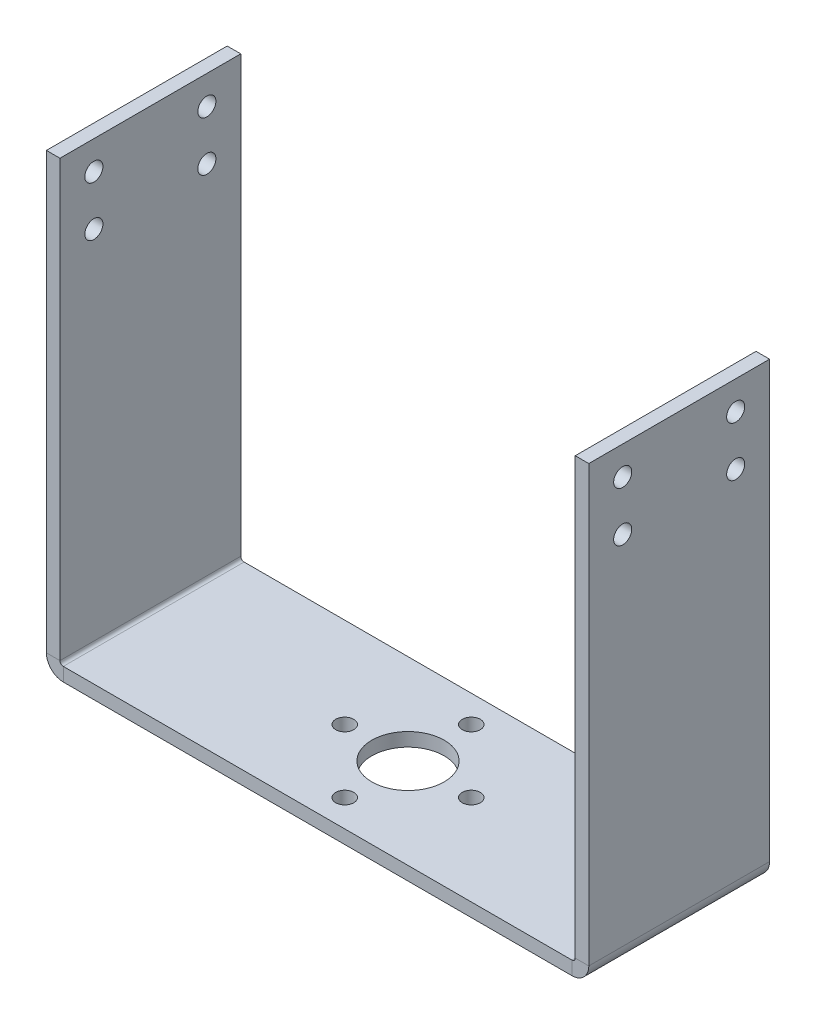
ISO-10303-21;
HEADER;
FILE_DESCRIPTION(('STEP AP214'),'2;1');
FILE_NAME('part.step','',(''),(''),'','','');
FILE_SCHEMA(('AUTOMOTIVE_DESIGN { 1 0 10303 214 1 1 1 1 }'));
ENDSEC;
DATA;
#1=APPLICATION_CONTEXT('core data for automotive mechanical design processes');
#2=APPLICATION_PROTOCOL_DEFINITION('international standard','automotive_design',2000,#1);
#3=PRODUCT_CONTEXT('',#1,'mechanical');
#4=PRODUCT('Part','Part','',(#3));
#5=PRODUCT_RELATED_PRODUCT_CATEGORY('part','',(#4));
#6=PRODUCT_DEFINITION_FORMATION('','',#4);
#7=PRODUCT_DEFINITION_CONTEXT('part definition',#1,'design');
#8=PRODUCT_DEFINITION('design','',#6,#7);
#9=PRODUCT_DEFINITION_SHAPE('','',#8);
#10=(LENGTH_UNIT() NAMED_UNIT(*) SI_UNIT(.MILLI.,.METRE.));
#11=(NAMED_UNIT(*) PLANE_ANGLE_UNIT() SI_UNIT($,.RADIAN.));
#12=(NAMED_UNIT(*) SI_UNIT($,.STERADIAN.) SOLID_ANGLE_UNIT());
#13=UNCERTAINTY_MEASURE_WITH_UNIT(LENGTH_MEASURE(1.E-05),#10,'distance_accuracy_value','');
#14=(GEOMETRIC_REPRESENTATION_CONTEXT(3) GLOBAL_UNCERTAINTY_ASSIGNED_CONTEXT((#13)) GLOBAL_UNIT_ASSIGNED_CONTEXT((#10,
#11,#12)) REPRESENTATION_CONTEXT('',''));
#15=CARTESIAN_POINT('',(0.,0.,0.));
#16=DIRECTION('',(0.,0.,1.));
#17=DIRECTION('',(1.,0.,0.));
#18=AXIS2_PLACEMENT_3D('',#15,#16,#17);
#19=CARTESIAN_POINT('',(0.,-3.,0.));
#20=DIRECTION('',(0.,1.,0.));
#21=DIRECTION('',(0.,0.,1.));
#22=AXIS2_PLACEMENT_3D('',#19,#20,#21);
#23=PLANE('',#22);
#24=CARTESIAN_POINT('',(0.,-3.,-14.));
#25=DIRECTION('',(0.,-1.,0.));
#26=DIRECTION('',(0.,0.,-1.));
#27=AXIS2_PLACEMENT_3D('',#24,#25,#26);
#28=CIRCLE('',#27,2.);
#29=CARTESIAN_POINT('',(0.,-3.,-16.));
#30=VERTEX_POINT('',#29);
#31=EDGE_CURVE('E300',#30,#30,#28,.T.);
#32=ORIENTED_EDGE('',*,*,#31,.F.);
#33=EDGE_LOOP('',(#32));
#34=FACE_BOUND('',#33,.T.);
#35=CARTESIAN_POINT('',(-14.,-3.,0.));
#36=DIRECTION('',(0.,-1.,0.));
#37=DIRECTION('',(0.,0.,-1.));
#38=AXIS2_PLACEMENT_3D('',#35,#36,#37);
#39=CIRCLE('',#38,2.);
#40=CARTESIAN_POINT('',(-14.,-3.,-2.));
#41=VERTEX_POINT('',#40);
#42=EDGE_CURVE('E297',#41,#41,#39,.T.);
#43=ORIENTED_EDGE('',*,*,#42,.F.);
#44=EDGE_LOOP('',(#43));
#45=FACE_BOUND('',#44,.T.);
#46=CARTESIAN_POINT('',(0.,-3.,14.));
#47=DIRECTION('',(0.,-1.,0.));
#48=DIRECTION('',(0.,0.,-1.));
#49=AXIS2_PLACEMENT_3D('',#46,#47,#48);
#50=CIRCLE('',#49,2.);
#51=CARTESIAN_POINT('',(0.,-3.,12.));
#52=VERTEX_POINT('',#51);
#53=EDGE_CURVE('E294',#52,#52,#50,.T.);
#54=ORIENTED_EDGE('',*,*,#53,.F.);
#55=EDGE_LOOP('',(#54));
#56=FACE_BOUND('',#55,.T.);
#57=CARTESIAN_POINT('',(14.,-3.,0.));
#58=DIRECTION('',(0.,-1.,0.));
#59=DIRECTION('',(0.,0.,-1.));
#60=AXIS2_PLACEMENT_3D('',#57,#58,#59);
#61=CIRCLE('',#60,2.);
#62=CARTESIAN_POINT('',(14.,-3.,-2.));
#63=VERTEX_POINT('',#62);
#64=EDGE_CURVE('E293',#63,#63,#61,.T.);
#65=ORIENTED_EDGE('',*,*,#64,.F.);
#66=EDGE_LOOP('',(#65));
#67=FACE_BOUND('',#66,.T.);
#68=CARTESIAN_POINT('',(0.,-3.,0.));
#69=DIRECTION('',(0.,-1.,0.));
#70=DIRECTION('',(0.,0.,-1.));
#71=AXIS2_PLACEMENT_3D('',#68,#69,#70);
#72=CIRCLE('',#71,8.);
#73=CARTESIAN_POINT('',(0.,-3.,-8.));
#74=VERTEX_POINT('',#73);
#75=EDGE_CURVE('E255',#74,#74,#72,.T.);
#76=ORIENTED_EDGE('',*,*,#75,.F.);
#77=EDGE_LOOP('',(#76));
#78=FACE_BOUND('',#77,.T.);
#79=DIRECTION('',(0.,0.,-1.));
#80=VECTOR('',#79,1.);
#81=CARTESIAN_POINT('',(56.2634000000001,-2.99999999999998,-20.));
#82=LINE('',#81,#80);
#83=CARTESIAN_POINT('',(56.2634000000001,-2.99999999999998,-20.));
#84=VERTEX_POINT('',#83);
#85=CARTESIAN_POINT('',(56.2634,-3.,20.));
#86=VERTEX_POINT('',#85);
#87=EDGE_CURVE('E137',#84,#86,#82,.F.);
#88=ORIENTED_EDGE('',*,*,#87,.T.);
#89=DIRECTION('',(1.,0.,0.));
#90=VECTOR('',#89,1.);
#91=CARTESIAN_POINT('',(-57.,-3.,20.));
#92=LINE('',#91,#90);
#93=CARTESIAN_POINT('',(-56.2634,-3.,20.));
#94=VERTEX_POINT('',#93);
#95=EDGE_CURVE('E11',#94,#86,#92,.T.);
#96=ORIENTED_EDGE('',*,*,#95,.F.);
#97=DIRECTION('',(0.,0.,1.));
#98=VECTOR('',#97,1.);
#99=CARTESIAN_POINT('',(-56.2634,-3.,20.));
#100=LINE('',#99,#98);
#101=CARTESIAN_POINT('',(-56.2634,-3.,-20.));
#102=VERTEX_POINT('',#101);
#103=EDGE_CURVE('E226',#94,#102,#100,.F.);
#104=ORIENTED_EDGE('',*,*,#103,.T.);
#105=DIRECTION('',(-1.,0.,0.));
#106=VECTOR('',#105,1.);
#107=CARTESIAN_POINT('',(-57.,-3.,-20.));
#108=LINE('',#107,#106);
#109=EDGE_CURVE('E47',#84,#102,#108,.T.);
#110=ORIENTED_EDGE('',*,*,#109,.F.);
#111=EDGE_LOOP('',(#88,#96,#104,#110));
#112=FACE_BOUND('',#111,.T.);
#113=ADVANCED_FACE('F38',(#34,#45,#56,#67,#78,#112),#23,.F.);
#114=CARTESIAN_POINT('',(0.,0.,0.));
#115=DIRECTION('',(0.,1.,0.));
#116=DIRECTION('',(0.,0.,1.));
#117=AXIS2_PLACEMENT_3D('',#114,#115,#116);
#118=PLANE('',#117);
#119=CARTESIAN_POINT('',(0.,0.,-14.));
#120=DIRECTION('',(0.,1.,0.));
#121=DIRECTION('',(0.,0.,1.));
#122=AXIS2_PLACEMENT_3D('',#119,#120,#121);
#123=CIRCLE('',#122,2.);
#124=CARTESIAN_POINT('',(0.,0.,-12.));
#125=VERTEX_POINT('',#124);
#126=EDGE_CURVE('E264',#125,#125,#123,.T.);
#127=ORIENTED_EDGE('',*,*,#126,.F.);
#128=EDGE_LOOP('',(#127));
#129=FACE_BOUND('',#128,.T.);
#130=CARTESIAN_POINT('',(-14.,0.,0.));
#131=DIRECTION('',(0.,1.,0.));
#132=DIRECTION('',(0.,0.,1.));
#133=AXIS2_PLACEMENT_3D('',#130,#131,#132);
#134=CIRCLE('',#133,2.);
#135=CARTESIAN_POINT('',(-14.,0.,2.));
#136=VERTEX_POINT('',#135);
#137=EDGE_CURVE('E261',#136,#136,#134,.T.);
#138=ORIENTED_EDGE('',*,*,#137,.F.);
#139=EDGE_LOOP('',(#138));
#140=FACE_BOUND('',#139,.T.);
#141=CARTESIAN_POINT('',(0.,0.,14.));
#142=DIRECTION('',(0.,1.,0.));
#143=DIRECTION('',(0.,0.,1.));
#144=AXIS2_PLACEMENT_3D('',#141,#142,#143);
#145=CIRCLE('',#144,2.);
#146=CARTESIAN_POINT('',(0.,0.,16.));
#147=VERTEX_POINT('',#146);
#148=EDGE_CURVE('E258',#147,#147,#145,.T.);
#149=ORIENTED_EDGE('',*,*,#148,.F.);
#150=EDGE_LOOP('',(#149));
#151=FACE_BOUND('',#150,.T.);
#152=CARTESIAN_POINT('',(14.,0.,0.));
#153=DIRECTION('',(0.,1.,0.));
#154=DIRECTION('',(0.,0.,1.));
#155=AXIS2_PLACEMENT_3D('',#152,#153,#154);
#156=CIRCLE('',#155,2.);
#157=CARTESIAN_POINT('',(14.,0.,2.));
#158=VERTEX_POINT('',#157);
#159=EDGE_CURVE('E254',#158,#158,#156,.T.);
#160=ORIENTED_EDGE('',*,*,#159,.F.);
#161=EDGE_LOOP('',(#160));
#162=FACE_BOUND('',#161,.T.);
#163=CARTESIAN_POINT('',(0.,0.,0.));
#164=DIRECTION('',(0.,1.,0.));
#165=DIRECTION('',(0.,0.,1.));
#166=AXIS2_PLACEMENT_3D('',#163,#164,#165);
#167=CIRCLE('',#166,8.);
#168=CARTESIAN_POINT('',(0.,0.,8.));
#169=VERTEX_POINT('',#168);
#170=EDGE_CURVE('E251',#169,#169,#167,.T.);
#171=ORIENTED_EDGE('',*,*,#170,.F.);
#172=EDGE_LOOP('',(#171));
#173=FACE_BOUND('',#172,.T.);
#174=DIRECTION('',(1.,0.,0.));
#175=VECTOR('',#174,1.);
#176=CARTESIAN_POINT('',(-57.,0.,20.));
#177=LINE('',#176,#175);
#178=CARTESIAN_POINT('',(-56.2634,0.,20.));
#179=VERTEX_POINT('',#178);
#180=CARTESIAN_POINT('',(56.2634,0.,20.));
#181=VERTEX_POINT('',#180);
#182=EDGE_CURVE('E247',#179,#181,#177,.T.);
#183=ORIENTED_EDGE('',*,*,#182,.T.);
#184=DIRECTION('',(0.,0.,-1.));
#185=VECTOR('',#184,1.);
#186=CARTESIAN_POINT('',(56.2634,0.,-20.));
#187=LINE('',#186,#185);
#188=CARTESIAN_POINT('',(56.2634,0.,-20.));
#189=VERTEX_POINT('',#188);
#190=EDGE_CURVE('E187',#189,#181,#187,.F.);
#191=ORIENTED_EDGE('',*,*,#190,.F.);
#192=DIRECTION('',(-1.,0.,0.));
#193=VECTOR('',#192,1.);
#194=CARTESIAN_POINT('',(-57.,0.,-20.));
#195=LINE('',#194,#193);
#196=CARTESIAN_POINT('',(-56.2634,0.,-20.));
#197=VERTEX_POINT('',#196);
#198=EDGE_CURVE('E244',#189,#197,#195,.T.);
#199=ORIENTED_EDGE('',*,*,#198,.T.);
#200=DIRECTION('',(0.,0.,1.));
#201=VECTOR('',#200,1.);
#202=CARTESIAN_POINT('',(-56.2634,0.,20.));
#203=LINE('',#202,#201);
#204=EDGE_CURVE('E55',#179,#197,#203,.F.);
#205=ORIENTED_EDGE('',*,*,#204,.F.);
#206=EDGE_LOOP('',(#183,#191,#199,#205));
#207=FACE_BOUND('',#206,.T.);
#208=ADVANCED_FACE('F338',(#129,#140,#151,#162,#173,#207),#118,.T.);
#209=CARTESIAN_POINT('',(-57.,-3.,-20.));
#210=DIRECTION('',(0.,0.,-1.));
#211=DIRECTION('',(-1.,0.,0.));
#212=AXIS2_PLACEMENT_3D('',#209,#210,#211);
#213=PLANE('',#212);
#214=ORIENTED_EDGE('',*,*,#198,.F.);
#215=DIRECTION('',(0.,-1.,0.));
#216=VECTOR('',#215,1.);
#217=CARTESIAN_POINT('',(56.2634,0.,-20.));
#218=LINE('',#217,#216);
#219=EDGE_CURVE('E183',#189,#84,#218,.T.);
#220=ORIENTED_EDGE('',*,*,#219,.T.);
#221=ORIENTED_EDGE('',*,*,#109,.T.);
#222=DIRECTION('',(0.,-1.,0.));
#223=VECTOR('',#222,1.);
#224=CARTESIAN_POINT('',(-56.2634,0.,-20.));
#225=LINE('',#224,#223);
#226=EDGE_CURVE('E241',#197,#102,#225,.T.);
#227=ORIENTED_EDGE('',*,*,#226,.F.);
#228=EDGE_LOOP('',(#214,#220,#221,#227));
#229=FACE_BOUND('',#228,.T.);
#230=ADVANCED_FACE('F40',(#229),#213,.T.);
#231=CARTESIAN_POINT('',(-57.,-3.,20.));
#232=DIRECTION('',(0.,0.,1.));
#233=DIRECTION('',(1.,0.,0.));
#234=AXIS2_PLACEMENT_3D('',#231,#232,#233);
#235=PLANE('',#234);
#236=DIRECTION('',(0.,-1.,0.));
#237=VECTOR('',#236,1.);
#238=CARTESIAN_POINT('',(56.2634,0.,20.));
#239=LINE('',#238,#237);
#240=EDGE_CURVE('E191',#181,#86,#239,.T.);
#241=ORIENTED_EDGE('',*,*,#240,.F.);
#242=ORIENTED_EDGE('',*,*,#182,.F.);
#243=DIRECTION('',(0.,-1.,0.));
#244=VECTOR('',#243,1.);
#245=CARTESIAN_POINT('',(-56.2634,0.,20.));
#246=LINE('',#245,#244);
#247=EDGE_CURVE('E232',#179,#94,#246,.T.);
#248=ORIENTED_EDGE('',*,*,#247,.T.);
#249=ORIENTED_EDGE('',*,*,#95,.T.);
#250=EDGE_LOOP('',(#241,#242,#248,#249));
#251=FACE_BOUND('',#250,.T.);
#252=ADVANCED_FACE('F351',(#251),#235,.T.);
#253=CARTESIAN_POINT('',(-56.2634,0.7366,-20.));
#254=DIRECTION('',(0.,0.,-1.));
#255=DIRECTION('',(-1.,0.,0.));
#256=AXIS2_PLACEMENT_3D('',#253,#254,#255);
#257=PLANE('',#256);
#258=DIRECTION('',(-1.,0.,0.));
#259=VECTOR('',#258,1.);
#260=CARTESIAN_POINT('',(-57.,0.736599999999997,-20.));
#261=LINE('',#260,#259);
#262=CARTESIAN_POINT('',(-57.,0.736599999999997,-20.));
#263=VERTEX_POINT('',#262);
#264=CARTESIAN_POINT('',(-60.,0.736599999999986,-20.));
#265=VERTEX_POINT('',#264);
#266=EDGE_CURVE('E194',#263,#265,#261,.T.);
#267=ORIENTED_EDGE('',*,*,#266,.F.);
#268=CARTESIAN_POINT('',(-56.2634,0.7366,-20.));
#269=DIRECTION('',(0.,0.,1.));
#270=DIRECTION('',(1.,0.,0.));
#271=AXIS2_PLACEMENT_3D('',#268,#269,#270);
#272=CIRCLE('',#271,0.736600000000004);
#273=EDGE_CURVE('E235',#197,#263,#272,.F.);
#274=ORIENTED_EDGE('',*,*,#273,.F.);
#275=ORIENTED_EDGE('',*,*,#226,.T.);
#276=CARTESIAN_POINT('',(-56.2634,0.7366,-20.));
#277=DIRECTION('',(0.,0.,1.));
#278=DIRECTION('',(1.,0.,0.));
#279=AXIS2_PLACEMENT_3D('',#276,#277,#278);
#280=CIRCLE('',#279,3.7366);
#281=EDGE_CURVE('E228',#102,#265,#280,.F.);
#282=ORIENTED_EDGE('',*,*,#281,.T.);
#283=EDGE_LOOP('',(#267,#274,#275,#282));
#284=FACE_BOUND('',#283,.T.);
#285=ADVANCED_FACE('F353',(#284),#257,.T.);
#286=CARTESIAN_POINT('',(-56.2634,0.7366,20.));
#287=DIRECTION('',(0.,0.,-1.));
#288=DIRECTION('',(-1.,0.,0.));
#289=AXIS2_PLACEMENT_3D('',#286,#287,#288);
#290=PLANE('',#289);
#291=CARTESIAN_POINT('',(-56.2634,0.7366,20.));
#292=DIRECTION('',(0.,0.,1.));
#293=DIRECTION('',(1.,0.,0.));
#294=AXIS2_PLACEMENT_3D('',#291,#292,#293);
#295=CIRCLE('',#294,0.736600000000004);
#296=CARTESIAN_POINT('',(-57.,0.736599999999997,20.));
#297=VERTEX_POINT('',#296);
#298=EDGE_CURVE('E225',#297,#179,#295,.T.);
#299=ORIENTED_EDGE('',*,*,#298,.F.);
#300=DIRECTION('',(-1.,0.,0.));
#301=VECTOR('',#300,1.);
#302=CARTESIAN_POINT('',(-57.,0.736599999999997,20.));
#303=LINE('',#302,#301);
#304=CARTESIAN_POINT('',(-60.,0.736599999999986,20.));
#305=VERTEX_POINT('',#304);
#306=EDGE_CURVE('E198',#297,#305,#303,.T.);
#307=ORIENTED_EDGE('',*,*,#306,.T.);
#308=CARTESIAN_POINT('',(-56.2634,0.7366,20.));
#309=DIRECTION('',(0.,0.,1.));
#310=DIRECTION('',(1.,0.,0.));
#311=AXIS2_PLACEMENT_3D('',#308,#309,#310);
#312=CIRCLE('',#311,3.7366);
#313=EDGE_CURVE('E229',#305,#94,#312,.T.);
#314=ORIENTED_EDGE('',*,*,#313,.T.);
#315=ORIENTED_EDGE('',*,*,#247,.F.);
#316=EDGE_LOOP('',(#299,#307,#314,#315));
#317=FACE_BOUND('',#316,.T.);
#318=ADVANCED_FACE('F349',(#317),#290,.F.);
#319=CARTESIAN_POINT('',(-56.2634,0.7366,20.));
#320=DIRECTION('',(0.,0.,1.));
#321=DIRECTION('',(-1.,0.,0.));
#322=AXIS2_PLACEMENT_3D('',#319,#320,#321);
#323=CYLINDRICAL_SURFACE('',#322,3.7366);
#324=ORIENTED_EDGE('',*,*,#103,.F.);
#325=ORIENTED_EDGE('',*,*,#313,.F.);
#326=DIRECTION('',(0.,0.,-1.));
#327=VECTOR('',#326,1.);
#328=CARTESIAN_POINT('',(-60.,0.736599999999986,0.));
#329=LINE('',#328,#327);
#330=EDGE_CURVE('E201',#305,#265,#329,.T.);
#331=ORIENTED_EDGE('',*,*,#330,.T.);
#332=ORIENTED_EDGE('',*,*,#281,.F.);
#333=EDGE_LOOP('',(#324,#325,#331,#332));
#334=FACE_BOUND('',#333,.T.);
#335=ADVANCED_FACE('F401',(#334),#323,.T.);
#336=CARTESIAN_POINT('',(-56.2634,0.7366,20.));
#337=DIRECTION('',(0.,0.,1.));
#338=DIRECTION('',(-1.,0.,0.));
#339=AXIS2_PLACEMENT_3D('',#336,#337,#338);
#340=CYLINDRICAL_SURFACE('',#339,0.736600000000004);
#341=ORIENTED_EDGE('',*,*,#204,.T.);
#342=ORIENTED_EDGE('',*,*,#273,.T.);
#343=DIRECTION('',(0.,0.,1.));
#344=VECTOR('',#343,1.);
#345=CARTESIAN_POINT('',(-57.,0.736599999999997,-20.));
#346=LINE('',#345,#344);
#347=EDGE_CURVE('E196',#263,#297,#346,.T.);
#348=ORIENTED_EDGE('',*,*,#347,.T.);
#349=ORIENTED_EDGE('',*,*,#298,.T.);
#350=EDGE_LOOP('',(#341,#342,#348,#349));
#351=FACE_BOUND('',#350,.T.);
#352=ADVANCED_FACE('F365',(#351),#340,.F.);
#353=CARTESIAN_POINT('',(-60.,0.,-20.));
#354=DIRECTION('',(0.,0.,1.));
#355=DIRECTION('',(1.,0.,0.));
#356=AXIS2_PLACEMENT_3D('',#353,#354,#355);
#357=PLANE('',#356);
#358=ORIENTED_EDGE('',*,*,#266,.T.);
#359=DIRECTION('',(0.,-1.,0.));
#360=VECTOR('',#359,1.);
#361=CARTESIAN_POINT('',(-60.,0.,-20.));
#362=LINE('',#361,#360);
#363=CARTESIAN_POINT('',(-60.0000000000003,97.,-20.));
#364=VERTEX_POINT('',#363);
#365=EDGE_CURVE('E206',#364,#265,#362,.T.);
#366=ORIENTED_EDGE('',*,*,#365,.F.);
#367=DIRECTION('',(1.,0.,0.));
#368=VECTOR('',#367,1.);
#369=CARTESIAN_POINT('',(-60.0000000000003,97.,-20.));
#370=LINE('',#369,#368);
#371=CARTESIAN_POINT('',(-57.0000000000003,97.,-20.));
#372=VERTEX_POINT('',#371);
#373=EDGE_CURVE('E214',#364,#372,#370,.T.);
#374=ORIENTED_EDGE('',*,*,#373,.T.);
#375=DIRECTION('',(0.,-1.,0.));
#376=VECTOR('',#375,1.);
#377=CARTESIAN_POINT('',(-57.,0.,-20.));
#378=LINE('',#377,#376);
#379=EDGE_CURVE('E205',#372,#263,#378,.T.);
#380=ORIENTED_EDGE('',*,*,#379,.T.);
#381=EDGE_LOOP('',(#358,#366,#374,#380));
#382=FACE_BOUND('',#381,.T.);
#383=ADVANCED_FACE('F370',(#382),#357,.F.);
#384=CARTESIAN_POINT('',(-60.0000000000003,97.,20.));
#385=DIRECTION('',(0.,0.,-1.));
#386=DIRECTION('',(-1.,0.,0.));
#387=AXIS2_PLACEMENT_3D('',#384,#385,#386);
#388=PLANE('',#387);
#389=ORIENTED_EDGE('',*,*,#306,.F.);
#390=DIRECTION('',(0.,1.,0.));
#391=VECTOR('',#390,1.);
#392=CARTESIAN_POINT('',(-57.0000000000003,97.,20.));
#393=LINE('',#392,#391);
#394=CARTESIAN_POINT('',(-57.0000000000003,97.,20.));
#395=VERTEX_POINT('',#394);
#396=EDGE_CURVE('E217',#297,#395,#393,.T.);
#397=ORIENTED_EDGE('',*,*,#396,.T.);
#398=DIRECTION('',(1.,0.,0.));
#399=VECTOR('',#398,1.);
#400=CARTESIAN_POINT('',(-60.0000000000003,97.,20.));
#401=LINE('',#400,#399);
#402=CARTESIAN_POINT('',(-60.0000000000003,97.,20.));
#403=VERTEX_POINT('',#402);
#404=EDGE_CURVE('E222',#403,#395,#401,.T.);
#405=ORIENTED_EDGE('',*,*,#404,.F.);
#406=DIRECTION('',(0.,1.,0.));
#407=VECTOR('',#406,1.);
#408=CARTESIAN_POINT('',(-60.0000000000003,97.,20.));
#409=LINE('',#408,#407);
#410=EDGE_CURVE('E209',#305,#403,#409,.T.);
#411=ORIENTED_EDGE('',*,*,#410,.F.);
#412=EDGE_LOOP('',(#389,#397,#405,#411));
#413=FACE_BOUND('',#412,.T.);
#414=ADVANCED_FACE('F388',(#413),#388,.F.);
#415=CARTESIAN_POINT('',(-60.,-2.10271667455838E-13,0.));
#416=DIRECTION('',(1.,0.,0.));
#417=DIRECTION('',(0.,1.,0.));
#418=AXIS2_PLACEMENT_3D('',#415,#416,#417);
#419=PLANE('',#418);
#420=CARTESIAN_POINT('',(-60.0000000000003,90.6742434027701,-12.5000000000001));
#421=DIRECTION('',(1.,0.,0.));
#422=DIRECTION('',(0.,1.,0.));
#423=AXIS2_PLACEMENT_3D('',#420,#421,#422);
#424=CIRCLE('',#423,2.);
#425=CARTESIAN_POINT('',(-60.0000000000003,92.6742434027701,-12.5000000000001));
#426=VERTEX_POINT('',#425);
#427=EDGE_CURVE('E707',#426,#426,#424,.F.);
#428=ORIENTED_EDGE('',*,*,#427,.F.);
#429=EDGE_LOOP('',(#428));
#430=FACE_BOUND('',#429,.T.);
#431=CARTESIAN_POINT('',(-60.0000000000003,79.6742434027701,12.4999999999999));
#432=DIRECTION('',(1.,0.,0.));
#433=DIRECTION('',(0.,1.,0.));
#434=AXIS2_PLACEMENT_3D('',#431,#432,#433);
#435=CIRCLE('',#434,2.);
#436=CARTESIAN_POINT('',(-60.0000000000003,81.6742434027701,12.4999999999999));
#437=VERTEX_POINT('',#436);
#438=EDGE_CURVE('E714',#437,#437,#435,.F.);
#439=ORIENTED_EDGE('',*,*,#438,.F.);
#440=EDGE_LOOP('',(#439));
#441=FACE_BOUND('',#440,.T.);
#442=CARTESIAN_POINT('',(-60.0000000000003,90.6742434027701,12.4999999999999));
#443=DIRECTION('',(1.,0.,0.));
#444=DIRECTION('',(0.,1.,0.));
#445=AXIS2_PLACEMENT_3D('',#442,#443,#444);
#446=CIRCLE('',#445,2.);
#447=CARTESIAN_POINT('',(-60.0000000000003,92.6742434027701,12.4999999999999));
#448=VERTEX_POINT('',#447);
#449=EDGE_CURVE('E721',#448,#448,#446,.F.);
#450=ORIENTED_EDGE('',*,*,#449,.F.);
#451=EDGE_LOOP('',(#450));
#452=FACE_BOUND('',#451,.T.);
#453=CARTESIAN_POINT('',(-60.0000000000003,79.6742434027701,-12.5000000000001));
#454=DIRECTION('',(1.,0.,0.));
#455=DIRECTION('',(0.,1.,0.));
#456=AXIS2_PLACEMENT_3D('',#453,#454,#455);
#457=CIRCLE('',#456,2.);
#458=CARTESIAN_POINT('',(-60.0000000000003,81.6742434027701,-12.5000000000001));
#459=VERTEX_POINT('',#458);
#460=EDGE_CURVE('E272',#459,#459,#457,.F.);
#461=ORIENTED_EDGE('',*,*,#460,.F.);
#462=EDGE_LOOP('',(#461));
#463=FACE_BOUND('',#462,.T.);
#464=ORIENTED_EDGE('',*,*,#330,.F.);
#465=ORIENTED_EDGE('',*,*,#410,.T.);
#466=DIRECTION('',(0.,0.,-1.));
#467=VECTOR('',#466,1.);
#468=CARTESIAN_POINT('',(-60.0000000000003,97.,-20.));
#469=LINE('',#468,#467);
#470=EDGE_CURVE('E212',#403,#364,#469,.T.);
#471=ORIENTED_EDGE('',*,*,#470,.T.);
#472=ORIENTED_EDGE('',*,*,#365,.T.);
#473=EDGE_LOOP('',(#464,#465,#471,#472));
#474=FACE_BOUND('',#473,.T.);
#475=ADVANCED_FACE('F374',(#430,#441,#452,#463,#474),#419,.F.);
#476=CARTESIAN_POINT('',(-57.,-1.99797223439308E-13,0.));
#477=DIRECTION('',(1.,0.,0.));
#478=DIRECTION('',(0.,1.,0.));
#479=AXIS2_PLACEMENT_3D('',#476,#477,#478);
#480=PLANE('',#479);
#481=CARTESIAN_POINT('',(-57.0000000000003,90.6742434027701,-12.5000000000001));
#482=DIRECTION('',(1.,0.,0.));
#483=DIRECTION('',(0.,1.,0.));
#484=AXIS2_PLACEMENT_3D('',#481,#482,#483);
#485=CIRCLE('',#484,2.);
#486=CARTESIAN_POINT('',(-57.0000000000003,92.6742434027701,-12.5000000000001));
#487=VERTEX_POINT('',#486);
#488=EDGE_CURVE('E290',#487,#487,#485,.T.);
#489=ORIENTED_EDGE('',*,*,#488,.F.);
#490=EDGE_LOOP('',(#489));
#491=FACE_BOUND('',#490,.T.);
#492=CARTESIAN_POINT('',(-57.0000000000003,79.6742434027701,12.4999999999999));
#493=DIRECTION('',(1.,0.,0.));
#494=DIRECTION('',(0.,1.,0.));
#495=AXIS2_PLACEMENT_3D('',#492,#493,#494);
#496=CIRCLE('',#495,2.);
#497=CARTESIAN_POINT('',(-57.0000000000003,81.6742434027701,12.4999999999999));
#498=VERTEX_POINT('',#497);
#499=EDGE_CURVE('E278',#498,#498,#496,.T.);
#500=ORIENTED_EDGE('',*,*,#499,.F.);
#501=EDGE_LOOP('',(#500));
#502=FACE_BOUND('',#501,.T.);
#503=CARTESIAN_POINT('',(-57.0000000000003,90.6742434027701,12.4999999999999));
#504=DIRECTION('',(1.,0.,0.));
#505=DIRECTION('',(0.,1.,0.));
#506=AXIS2_PLACEMENT_3D('',#503,#504,#505);
#507=CIRCLE('',#506,2.);
#508=CARTESIAN_POINT('',(-57.0000000000003,92.6742434027701,12.4999999999999));
#509=VERTEX_POINT('',#508);
#510=EDGE_CURVE('E275',#509,#509,#507,.T.);
#511=ORIENTED_EDGE('',*,*,#510,.F.);
#512=EDGE_LOOP('',(#511));
#513=FACE_BOUND('',#512,.T.);
#514=CARTESIAN_POINT('',(-57.0000000000003,79.6742434027701,-12.5000000000001));
#515=DIRECTION('',(1.,0.,0.));
#516=DIRECTION('',(0.,1.,0.));
#517=AXIS2_PLACEMENT_3D('',#514,#515,#516);
#518=CIRCLE('',#517,2.);
#519=CARTESIAN_POINT('',(-57.0000000000003,81.6742434027701,-12.5000000000001));
#520=VERTEX_POINT('',#519);
#521=EDGE_CURVE('E271',#520,#520,#518,.T.);
#522=ORIENTED_EDGE('',*,*,#521,.F.);
#523=EDGE_LOOP('',(#522));
#524=FACE_BOUND('',#523,.T.);
#525=ORIENTED_EDGE('',*,*,#396,.F.);
#526=ORIENTED_EDGE('',*,*,#347,.F.);
#527=ORIENTED_EDGE('',*,*,#379,.F.);
#528=DIRECTION('',(0.,0.,-1.));
#529=VECTOR('',#528,1.);
#530=CARTESIAN_POINT('',(-57.0000000000003,97.,-20.));
#531=LINE('',#530,#529);
#532=EDGE_CURVE('E210',#395,#372,#531,.T.);
#533=ORIENTED_EDGE('',*,*,#532,.F.);
#534=EDGE_LOOP('',(#525,#526,#527,#533));
#535=FACE_BOUND('',#534,.T.);
#536=ADVANCED_FACE('F384',(#491,#502,#513,#524,#535),#480,.T.);
#537=CARTESIAN_POINT('',(-60.0000000000003,97.,-20.));
#538=DIRECTION('',(0.,-1.,0.));
#539=DIRECTION('',(1.,0.,0.));
#540=AXIS2_PLACEMENT_3D('',#537,#538,#539);
#541=PLANE('',#540);
#542=ORIENTED_EDGE('',*,*,#532,.T.);
#543=ORIENTED_EDGE('',*,*,#373,.F.);
#544=ORIENTED_EDGE('',*,*,#470,.F.);
#545=ORIENTED_EDGE('',*,*,#404,.T.);
#546=EDGE_LOOP('',(#542,#543,#544,#545));
#547=FACE_BOUND('',#546,.T.);
#548=ADVANCED_FACE('F380',(#547),#541,.F.);
#549=CARTESIAN_POINT('',(56.2634,0.7366,20.));
#550=DIRECTION('',(0.,0.,1.));
#551=DIRECTION('',(1.,0.,0.));
#552=AXIS2_PLACEMENT_3D('',#549,#550,#551);
#553=PLANE('',#552);
#554=DIRECTION('',(1.,0.,0.));
#555=VECTOR('',#554,1.);
#556=CARTESIAN_POINT('',(57.,0.736599999999997,20.));
#557=LINE('',#556,#555);
#558=CARTESIAN_POINT('',(57.,0.736599999999997,20.));
#559=VERTEX_POINT('',#558);
#560=CARTESIAN_POINT('',(60.,0.736599999999986,20.));
#561=VERTEX_POINT('',#560);
#562=EDGE_CURVE('E267',#559,#561,#557,.T.);
#563=ORIENTED_EDGE('',*,*,#562,.F.);
#564=CARTESIAN_POINT('',(56.2634,0.7366,20.));
#565=DIRECTION('',(0.,0.,-1.));
#566=DIRECTION('',(-1.,0.,0.));
#567=AXIS2_PLACEMENT_3D('',#564,#565,#566);
#568=CIRCLE('',#567,0.736599999999976);
#569=EDGE_CURVE('E140',#181,#559,#568,.F.);
#570=ORIENTED_EDGE('',*,*,#569,.F.);
#571=ORIENTED_EDGE('',*,*,#240,.T.);
#572=CARTESIAN_POINT('',(56.2634,0.7366,20.));
#573=DIRECTION('',(0.,0.,-1.));
#574=DIRECTION('',(-1.,0.,0.));
#575=AXIS2_PLACEMENT_3D('',#572,#573,#574);
#576=CIRCLE('',#575,3.73659999999998);
#577=EDGE_CURVE('E182',#86,#561,#576,.F.);
#578=ORIENTED_EDGE('',*,*,#577,.T.);
#579=EDGE_LOOP('',(#563,#570,#571,#578));
#580=FACE_BOUND('',#579,.T.);
#581=ADVANCED_FACE('F314',(#580),#553,.T.);
#582=CARTESIAN_POINT('',(56.2634,0.7366,-20.));
#583=DIRECTION('',(0.,0.,1.));
#584=DIRECTION('',(1.,0.,0.));
#585=AXIS2_PLACEMENT_3D('',#582,#583,#584);
#586=PLANE('',#585);
#587=CARTESIAN_POINT('',(56.2634,0.7366,-20.));
#588=DIRECTION('',(0.,0.,-1.));
#589=DIRECTION('',(-1.,0.,0.));
#590=AXIS2_PLACEMENT_3D('',#587,#588,#589);
#591=CIRCLE('',#590,0.736599999999976);
#592=CARTESIAN_POINT('',(57.,0.736599999999997,-20.));
#593=VERTEX_POINT('',#592);
#594=EDGE_CURVE('E147',#593,#189,#591,.T.);
#595=ORIENTED_EDGE('',*,*,#594,.F.);
#596=DIRECTION('',(1.,0.,0.));
#597=VECTOR('',#596,1.);
#598=CARTESIAN_POINT('',(57.,0.736599999999997,-20.));
#599=LINE('',#598,#597);
#600=CARTESIAN_POINT('',(60.,0.736599999999986,-20.));
#601=VERTEX_POINT('',#600);
#602=EDGE_CURVE('E144',#593,#601,#599,.T.);
#603=ORIENTED_EDGE('',*,*,#602,.T.);
#604=CARTESIAN_POINT('',(56.2634,0.7366,-20.));
#605=DIRECTION('',(0.,0.,-1.));
#606=DIRECTION('',(-1.,0.,0.));
#607=AXIS2_PLACEMENT_3D('',#604,#605,#606);
#608=CIRCLE('',#607,3.73659999999998);
#609=EDGE_CURVE('E130',#601,#84,#608,.T.);
#610=ORIENTED_EDGE('',*,*,#609,.T.);
#611=ORIENTED_EDGE('',*,*,#219,.F.);
#612=EDGE_LOOP('',(#595,#603,#610,#611));
#613=FACE_BOUND('',#612,.T.);
#614=ADVANCED_FACE('F145',(#613),#586,.F.);
#615=CARTESIAN_POINT('',(56.2634,0.7366,-20.));
#616=DIRECTION('',(0.,0.,-1.));
#617=DIRECTION('',(1.,0.,0.));
#618=AXIS2_PLACEMENT_3D('',#615,#616,#617);
#619=CYLINDRICAL_SURFACE('',#618,3.73659999999998);
#620=ORIENTED_EDGE('',*,*,#87,.F.);
#621=ORIENTED_EDGE('',*,*,#609,.F.);
#622=DIRECTION('',(0.,0.,1.));
#623=VECTOR('',#622,1.);
#624=CARTESIAN_POINT('',(60.,0.736599999999986,0.));
#625=LINE('',#624,#623);
#626=EDGE_CURVE('E135',#601,#561,#625,.T.);
#627=ORIENTED_EDGE('',*,*,#626,.T.);
#628=ORIENTED_EDGE('',*,*,#577,.F.);
#629=EDGE_LOOP('',(#620,#621,#627,#628));
#630=FACE_BOUND('',#629,.T.);
#631=ADVANCED_FACE('F132',(#630),#619,.T.);
#632=CARTESIAN_POINT('',(56.2634,0.7366,-20.));
#633=DIRECTION('',(0.,0.,-1.));
#634=DIRECTION('',(1.,0.,0.));
#635=AXIS2_PLACEMENT_3D('',#632,#633,#634);
#636=CYLINDRICAL_SURFACE('',#635,0.736599999999976);
#637=ORIENTED_EDGE('',*,*,#190,.T.);
#638=ORIENTED_EDGE('',*,*,#569,.T.);
#639=DIRECTION('',(0.,0.,-1.));
#640=VECTOR('',#639,1.);
#641=CARTESIAN_POINT('',(57.,0.736599999999997,20.));
#642=LINE('',#641,#640);
#643=EDGE_CURVE('E151',#559,#593,#642,.T.);
#644=ORIENTED_EDGE('',*,*,#643,.T.);
#645=ORIENTED_EDGE('',*,*,#594,.T.);
#646=EDGE_LOOP('',(#637,#638,#644,#645));
#647=FACE_BOUND('',#646,.T.);
#648=ADVANCED_FACE('F317',(#647),#636,.F.);
#649=CARTESIAN_POINT('',(60.,0.,20.));
#650=DIRECTION('',(0.,0.,-1.));
#651=DIRECTION('',(-1.,0.,0.));
#652=AXIS2_PLACEMENT_3D('',#649,#650,#651);
#653=PLANE('',#652);
#654=ORIENTED_EDGE('',*,*,#562,.T.);
#655=DIRECTION('',(0.,-1.,0.));
#656=VECTOR('',#655,1.);
#657=CARTESIAN_POINT('',(60.,0.,20.));
#658=LINE('',#657,#656);
#659=CARTESIAN_POINT('',(60.0000000000003,97.,20.));
#660=VERTEX_POINT('',#659);
#661=EDGE_CURVE('E159',#660,#561,#658,.T.);
#662=ORIENTED_EDGE('',*,*,#661,.F.);
#663=DIRECTION('',(-1.,0.,0.));
#664=VECTOR('',#663,1.);
#665=CARTESIAN_POINT('',(60.0000000000003,97.,20.));
#666=LINE('',#665,#664);
#667=CARTESIAN_POINT('',(57.0000000000003,97.,20.));
#668=VERTEX_POINT('',#667);
#669=EDGE_CURVE('E168',#660,#668,#666,.T.);
#670=ORIENTED_EDGE('',*,*,#669,.T.);
#671=DIRECTION('',(0.,-1.,0.));
#672=VECTOR('',#671,1.);
#673=CARTESIAN_POINT('',(57.,0.,20.));
#674=LINE('',#673,#672);
#675=EDGE_CURVE('E160',#668,#559,#674,.T.);
#676=ORIENTED_EDGE('',*,*,#675,.T.);
#677=EDGE_LOOP('',(#654,#662,#670,#676));
#678=FACE_BOUND('',#677,.T.);
#679=ADVANCED_FACE('F310',(#678),#653,.F.);
#680=CARTESIAN_POINT('',(60.0000000000003,97.,-20.));
#681=DIRECTION('',(0.,0.,1.));
#682=DIRECTION('',(1.,0.,0.));
#683=AXIS2_PLACEMENT_3D('',#680,#681,#682);
#684=PLANE('',#683);
#685=ORIENTED_EDGE('',*,*,#602,.F.);
#686=DIRECTION('',(0.,1.,0.));
#687=VECTOR('',#686,1.);
#688=CARTESIAN_POINT('',(57.0000000000003,97.,-20.));
#689=LINE('',#688,#687);
#690=CARTESIAN_POINT('',(57.0000000000003,97.,-20.));
#691=VERTEX_POINT('',#690);
#692=EDGE_CURVE('E175',#593,#691,#689,.T.);
#693=ORIENTED_EDGE('',*,*,#692,.T.);
#694=DIRECTION('',(-1.,0.,0.));
#695=VECTOR('',#694,1.);
#696=CARTESIAN_POINT('',(60.0000000000003,97.,-20.));
#697=LINE('',#696,#695);
#698=CARTESIAN_POINT('',(60.0000000000003,97.,-20.));
#699=VERTEX_POINT('',#698);
#700=EDGE_CURVE('E164',#699,#691,#697,.T.);
#701=ORIENTED_EDGE('',*,*,#700,.F.);
#702=DIRECTION('',(0.,1.,0.));
#703=VECTOR('',#702,1.);
#704=CARTESIAN_POINT('',(60.0000000000003,97.,-20.));
#705=LINE('',#704,#703);
#706=EDGE_CURVE('E156',#601,#699,#705,.T.);
#707=ORIENTED_EDGE('',*,*,#706,.F.);
#708=EDGE_LOOP('',(#685,#693,#701,#707));
#709=FACE_BOUND('',#708,.T.);
#710=ADVANCED_FACE('F162',(#709),#684,.F.);
#711=CARTESIAN_POINT('',(60.,-2.10271667455837E-13,0.));
#712=DIRECTION('',(-1.,0.,0.));
#713=DIRECTION('',(0.,-1.,0.));
#714=AXIS2_PLACEMENT_3D('',#711,#712,#713);
#715=PLANE('',#714);
#716=CARTESIAN_POINT('',(60.0000000000003,90.6742434027697,-12.5));
#717=DIRECTION('',(1.,0.,0.));
#718=DIRECTION('',(0.,1.,0.));
#719=AXIS2_PLACEMENT_3D('',#716,#717,#718);
#720=CIRCLE('',#719,2.);
#721=CARTESIAN_POINT('',(60.0000000000003,92.6742434027697,-12.5));
#722=VERTEX_POINT('',#721);
#723=EDGE_CURVE('E709',#722,#722,#720,.T.);
#724=ORIENTED_EDGE('',*,*,#723,.F.);
#725=EDGE_LOOP('',(#724));
#726=FACE_BOUND('',#725,.T.);
#727=CARTESIAN_POINT('',(60.0000000000003,79.6742434027697,12.5));
#728=DIRECTION('',(1.,0.,0.));
#729=DIRECTION('',(0.,1.,0.));
#730=AXIS2_PLACEMENT_3D('',#727,#728,#729);
#731=CIRCLE('',#730,2.);
#732=CARTESIAN_POINT('',(60.0000000000003,81.6742434027697,12.5));
#733=VERTEX_POINT('',#732);
#734=EDGE_CURVE('E718',#733,#733,#731,.T.);
#735=ORIENTED_EDGE('',*,*,#734,.F.);
#736=EDGE_LOOP('',(#735));
#737=FACE_BOUND('',#736,.T.);
#738=CARTESIAN_POINT('',(60.0000000000003,90.6742434027697,12.5));
#739=DIRECTION('',(1.,0.,0.));
#740=DIRECTION('',(0.,1.,0.));
#741=AXIS2_PLACEMENT_3D('',#738,#739,#740);
#742=CIRCLE('',#741,2.);
#743=CARTESIAN_POINT('',(60.0000000000003,92.6742434027697,12.5));
#744=VERTEX_POINT('',#743);
#745=EDGE_CURVE('E734',#744,#744,#742,.T.);
#746=ORIENTED_EDGE('',*,*,#745,.F.);
#747=EDGE_LOOP('',(#746));
#748=FACE_BOUND('',#747,.T.);
#749=CARTESIAN_POINT('',(60.0000000000003,79.6742434027697,-12.5));
#750=DIRECTION('',(1.,0.,0.));
#751=DIRECTION('',(0.,1.,0.));
#752=AXIS2_PLACEMENT_3D('',#749,#750,#751);
#753=CIRCLE('',#752,2.);
#754=CARTESIAN_POINT('',(60.0000000000003,81.6742434027697,-12.5));
#755=VERTEX_POINT('',#754);
#756=EDGE_CURVE('E708',#755,#755,#753,.T.);
#757=ORIENTED_EDGE('',*,*,#756,.F.);
#758=EDGE_LOOP('',(#757));
#759=FACE_BOUND('',#758,.T.);
#760=ORIENTED_EDGE('',*,*,#626,.F.);
#761=ORIENTED_EDGE('',*,*,#706,.T.);
#762=DIRECTION('',(0.,0.,1.));
#763=VECTOR('',#762,1.);
#764=CARTESIAN_POINT('',(60.0000000000003,97.,20.));
#765=LINE('',#764,#763);
#766=EDGE_CURVE('E166',#699,#660,#765,.T.);
#767=ORIENTED_EDGE('',*,*,#766,.T.);
#768=ORIENTED_EDGE('',*,*,#661,.T.);
#769=EDGE_LOOP('',(#760,#761,#767,#768));
#770=FACE_BOUND('',#769,.T.);
#771=ADVANCED_FACE('F155',(#726,#737,#748,#759,#770),#715,.F.);
#772=CARTESIAN_POINT('',(57.,-1.99797223439308E-13,0.));
#773=DIRECTION('',(-1.,0.,0.));
#774=DIRECTION('',(0.,-1.,0.));
#775=AXIS2_PLACEMENT_3D('',#772,#773,#774);
#776=PLANE('',#775);
#777=CARTESIAN_POINT('',(57.0000000000003,90.6742434027697,-12.5));
#778=DIRECTION('',(-1.,0.,0.));
#779=DIRECTION('',(0.,-1.,0.));
#780=AXIS2_PLACEMENT_3D('',#777,#778,#779);
#781=CIRCLE('',#780,2.);
#782=CARTESIAN_POINT('',(57.0000000000003,88.6742434027697,-12.5));
#783=VERTEX_POINT('',#782);
#784=EDGE_CURVE('E42',#783,#783,#781,.T.);
#785=ORIENTED_EDGE('',*,*,#784,.F.);
#786=EDGE_LOOP('',(#785));
#787=FACE_BOUND('',#786,.T.);
#788=CARTESIAN_POINT('',(57.0000000000003,79.6742434027697,12.5));
#789=DIRECTION('',(-1.,0.,0.));
#790=DIRECTION('',(0.,-1.,0.));
#791=AXIS2_PLACEMENT_3D('',#788,#789,#790);
#792=CIRCLE('',#791,2.);
#793=CARTESIAN_POINT('',(57.0000000000002,77.6742434027697,12.5));
#794=VERTEX_POINT('',#793);
#795=EDGE_CURVE('E276',#794,#794,#792,.T.);
#796=ORIENTED_EDGE('',*,*,#795,.F.);
#797=EDGE_LOOP('',(#796));
#798=FACE_BOUND('',#797,.T.);
#799=CARTESIAN_POINT('',(57.0000000000003,90.6742434027697,12.5));
#800=DIRECTION('',(-1.,0.,0.));
#801=DIRECTION('',(0.,-1.,0.));
#802=AXIS2_PLACEMENT_3D('',#799,#800,#801);
#803=CIRCLE('',#802,2.);
#804=CARTESIAN_POINT('',(57.0000000000003,88.6742434027697,12.5));
#805=VERTEX_POINT('',#804);
#806=EDGE_CURVE('E273',#805,#805,#803,.T.);
#807=ORIENTED_EDGE('',*,*,#806,.F.);
#808=EDGE_LOOP('',(#807));
#809=FACE_BOUND('',#808,.T.);
#810=CARTESIAN_POINT('',(57.0000000000003,79.6742434027697,-12.5));
#811=DIRECTION('',(-1.,0.,0.));
#812=DIRECTION('',(0.,-1.,0.));
#813=AXIS2_PLACEMENT_3D('',#810,#811,#812);
#814=CIRCLE('',#813,2.);
#815=CARTESIAN_POINT('',(57.0000000000003,77.6742434027697,-12.5));
#816=VERTEX_POINT('',#815);
#817=EDGE_CURVE('E268',#816,#816,#814,.T.);
#818=ORIENTED_EDGE('',*,*,#817,.F.);
#819=EDGE_LOOP('',(#818));
#820=FACE_BOUND('',#819,.T.);
#821=ORIENTED_EDGE('',*,*,#692,.F.);
#822=ORIENTED_EDGE('',*,*,#643,.F.);
#823=ORIENTED_EDGE('',*,*,#675,.F.);
#824=DIRECTION('',(0.,0.,1.));
#825=VECTOR('',#824,1.);
#826=CARTESIAN_POINT('',(57.0000000000003,97.,20.));
#827=LINE('',#826,#825);
#828=EDGE_CURVE('E170',#691,#668,#827,.T.);
#829=ORIENTED_EDGE('',*,*,#828,.F.);
#830=EDGE_LOOP('',(#821,#822,#823,#829));
#831=FACE_BOUND('',#830,.T.);
#832=ADVANCED_FACE('F319',(#787,#798,#809,#820,#831),#776,.T.);
#833=CARTESIAN_POINT('',(60.0000000000003,97.,20.));
#834=DIRECTION('',(0.,-1.,0.));
#835=DIRECTION('',(1.,0.,0.));
#836=AXIS2_PLACEMENT_3D('',#833,#834,#835);
#837=PLANE('',#836);
#838=ORIENTED_EDGE('',*,*,#828,.T.);
#839=ORIENTED_EDGE('',*,*,#669,.F.);
#840=ORIENTED_EDGE('',*,*,#766,.F.);
#841=ORIENTED_EDGE('',*,*,#700,.T.);
#842=EDGE_LOOP('',(#838,#839,#840,#841));
#843=FACE_BOUND('',#842,.T.);
#844=ADVANCED_FACE('F322',(#843),#837,.F.);
#845=CARTESIAN_POINT('',(0.,7.,0.));
#846=DIRECTION('',(0.,-1.,0.));
#847=DIRECTION('',(0.,0.,-1.));
#848=AXIS2_PLACEMENT_3D('',#845,#846,#847);
#849=CYLINDRICAL_SURFACE('',#848,8.);
#850=ORIENTED_EDGE('',*,*,#170,.T.);
#851=EDGE_LOOP('',(#850));
#852=FACE_BOUND('',#851,.T.);
#853=ORIENTED_EDGE('',*,*,#75,.T.);
#854=EDGE_LOOP('',(#853));
#855=FACE_BOUND('',#854,.T.);
#856=ADVANCED_FACE('F325',(#852,#855),#849,.F.);
#857=CARTESIAN_POINT('',(14.,7.,0.));
#858=DIRECTION('',(0.,-1.,0.));
#859=DIRECTION('',(0.,0.,-1.));
#860=AXIS2_PLACEMENT_3D('',#857,#858,#859);
#861=CYLINDRICAL_SURFACE('',#860,2.);
#862=ORIENTED_EDGE('',*,*,#159,.T.);
#863=EDGE_LOOP('',(#862));
#864=FACE_BOUND('',#863,.T.);
#865=ORIENTED_EDGE('',*,*,#64,.T.);
#866=EDGE_LOOP('',(#865));
#867=FACE_BOUND('',#866,.T.);
#868=ADVANCED_FACE('F331',(#864,#867),#861,.F.);
#869=CARTESIAN_POINT('',(0.,7.,14.));
#870=DIRECTION('',(0.,-1.,0.));
#871=DIRECTION('',(0.,0.,-1.));
#872=AXIS2_PLACEMENT_3D('',#869,#870,#871);
#873=CYLINDRICAL_SURFACE('',#872,2.);
#874=ORIENTED_EDGE('',*,*,#148,.T.);
#875=EDGE_LOOP('',(#874));
#876=FACE_BOUND('',#875,.T.);
#877=ORIENTED_EDGE('',*,*,#53,.T.);
#878=EDGE_LOOP('',(#877));
#879=FACE_BOUND('',#878,.T.);
#880=ADVANCED_FACE('F532',(#876,#879),#873,.F.);
#881=CARTESIAN_POINT('',(-14.,7.,0.));
#882=DIRECTION('',(0.,-1.,0.));
#883=DIRECTION('',(0.,0.,-1.));
#884=AXIS2_PLACEMENT_3D('',#881,#882,#883);
#885=CYLINDRICAL_SURFACE('',#884,2.);
#886=ORIENTED_EDGE('',*,*,#137,.T.);
#887=EDGE_LOOP('',(#886));
#888=FACE_BOUND('',#887,.T.);
#889=ORIENTED_EDGE('',*,*,#42,.T.);
#890=EDGE_LOOP('',(#889));
#891=FACE_BOUND('',#890,.T.);
#892=ADVANCED_FACE('F543',(#888,#891),#885,.F.);
#893=CARTESIAN_POINT('',(0.,7.,-14.));
#894=DIRECTION('',(0.,-1.,0.));
#895=DIRECTION('',(0.,0.,-1.));
#896=AXIS2_PLACEMENT_3D('',#893,#894,#895);
#897=CYLINDRICAL_SURFACE('',#896,2.);
#898=ORIENTED_EDGE('',*,*,#126,.T.);
#899=EDGE_LOOP('',(#898));
#900=FACE_BOUND('',#899,.T.);
#901=ORIENTED_EDGE('',*,*,#31,.T.);
#902=EDGE_LOOP('',(#901));
#903=FACE_BOUND('',#902,.T.);
#904=ADVANCED_FACE('F554',(#900,#903),#897,.F.);
#905=CARTESIAN_POINT('',(-65.6568542494928,79.6742434027701,-12.5000000000001));
#906=DIRECTION('',(1.,0.,0.));
#907=DIRECTION('',(0.,1.,0.));
#908=AXIS2_PLACEMENT_3D('',#905,#906,#907);
#909=CYLINDRICAL_SURFACE('',#908,2.);
#910=ORIENTED_EDGE('',*,*,#817,.T.);
#911=EDGE_LOOP('',(#910));
#912=FACE_BOUND('',#911,.T.);
#913=ORIENTED_EDGE('',*,*,#756,.T.);
#914=EDGE_LOOP('',(#913));
#915=FACE_BOUND('',#914,.T.);
#916=ADVANCED_FACE('F565',(#912,#915),#909,.F.);
#917=CARTESIAN_POINT('',(-65.6568542494927,90.6742434027701,12.4999999999999));
#918=DIRECTION('',(1.,0.,0.));
#919=DIRECTION('',(0.,1.,0.));
#920=AXIS2_PLACEMENT_3D('',#917,#918,#919);
#921=CYLINDRICAL_SURFACE('',#920,2.);
#922=ORIENTED_EDGE('',*,*,#806,.T.);
#923=EDGE_LOOP('',(#922));
#924=FACE_BOUND('',#923,.T.);
#925=ORIENTED_EDGE('',*,*,#745,.T.);
#926=EDGE_LOOP('',(#925));
#927=FACE_BOUND('',#926,.T.);
#928=ADVANCED_FACE('F603',(#924,#927),#921,.F.);
#929=CARTESIAN_POINT('',(-65.6568542494928,79.6742434027701,12.4999999999999));
#930=DIRECTION('',(1.,0.,0.));
#931=DIRECTION('',(0.,1.,0.));
#932=AXIS2_PLACEMENT_3D('',#929,#930,#931);
#933=CYLINDRICAL_SURFACE('',#932,2.);
#934=ORIENTED_EDGE('',*,*,#795,.T.);
#935=EDGE_LOOP('',(#934));
#936=FACE_BOUND('',#935,.T.);
#937=ORIENTED_EDGE('',*,*,#734,.T.);
#938=EDGE_LOOP('',(#937));
#939=FACE_BOUND('',#938,.T.);
#940=ADVANCED_FACE('F615',(#936,#939),#933,.F.);
#941=CARTESIAN_POINT('',(-65.6568542494927,90.6742434027701,-12.5000000000001));
#942=DIRECTION('',(1.,0.,0.));
#943=DIRECTION('',(0.,1.,0.));
#944=AXIS2_PLACEMENT_3D('',#941,#942,#943);
#945=CYLINDRICAL_SURFACE('',#944,2.);
#946=ORIENTED_EDGE('',*,*,#784,.T.);
#947=EDGE_LOOP('',(#946));
#948=FACE_BOUND('',#947,.T.);
#949=ORIENTED_EDGE('',*,*,#723,.T.);
#950=EDGE_LOOP('',(#949));
#951=FACE_BOUND('',#950,.T.);
#952=ADVANCED_FACE('F627',(#948,#951),#945,.F.);
#953=ORIENTED_EDGE('',*,*,#521,.T.);
#954=EDGE_LOOP('',(#953));
#955=FACE_BOUND('',#954,.T.);
#956=ORIENTED_EDGE('',*,*,#460,.T.);
#957=EDGE_LOOP('',(#956));
#958=FACE_BOUND('',#957,.T.);
#959=ADVANCED_FACE('F606',(#955,#958),#909,.F.);
#960=ORIENTED_EDGE('',*,*,#510,.T.);
#961=EDGE_LOOP('',(#960));
#962=FACE_BOUND('',#961,.T.);
#963=ORIENTED_EDGE('',*,*,#449,.T.);
#964=EDGE_LOOP('',(#963));
#965=FACE_BOUND('',#964,.T.);
#966=ADVANCED_FACE('F618',(#962,#965),#921,.F.);
#967=ORIENTED_EDGE('',*,*,#499,.T.);
#968=EDGE_LOOP('',(#967));
#969=FACE_BOUND('',#968,.T.);
#970=ORIENTED_EDGE('',*,*,#438,.T.);
#971=EDGE_LOOP('',(#970));
#972=FACE_BOUND('',#971,.T.);
#973=ADVANCED_FACE('F629',(#969,#972),#933,.F.);
#974=ORIENTED_EDGE('',*,*,#488,.T.);
#975=EDGE_LOOP('',(#974));
#976=FACE_BOUND('',#975,.T.);
#977=ORIENTED_EDGE('',*,*,#427,.T.);
#978=EDGE_LOOP('',(#977));
#979=FACE_BOUND('',#978,.T.);
#980=ADVANCED_FACE('F640',(#976,#979),#945,.F.);
#981=CLOSED_SHELL('',(#113,#208,#230,#252,#285,#318,#335,#352,#383,#414,#475,#536,#548,#581,
#614,#631,#648,#679,#710,#771,#832,#844,#856,#868,#880,#892,#904,#916,#928,#940,#952,#959,#966,
#973,#980));
#982=MANIFOLD_SOLID_BREP('B2',#981);
#983=ADVANCED_BREP_SHAPE_REPRESENTATION('',(#18,#982),#14);
#984=SHAPE_DEFINITION_REPRESENTATION(#9,#983);
ENDSEC;
END-ISO-10303-21;
